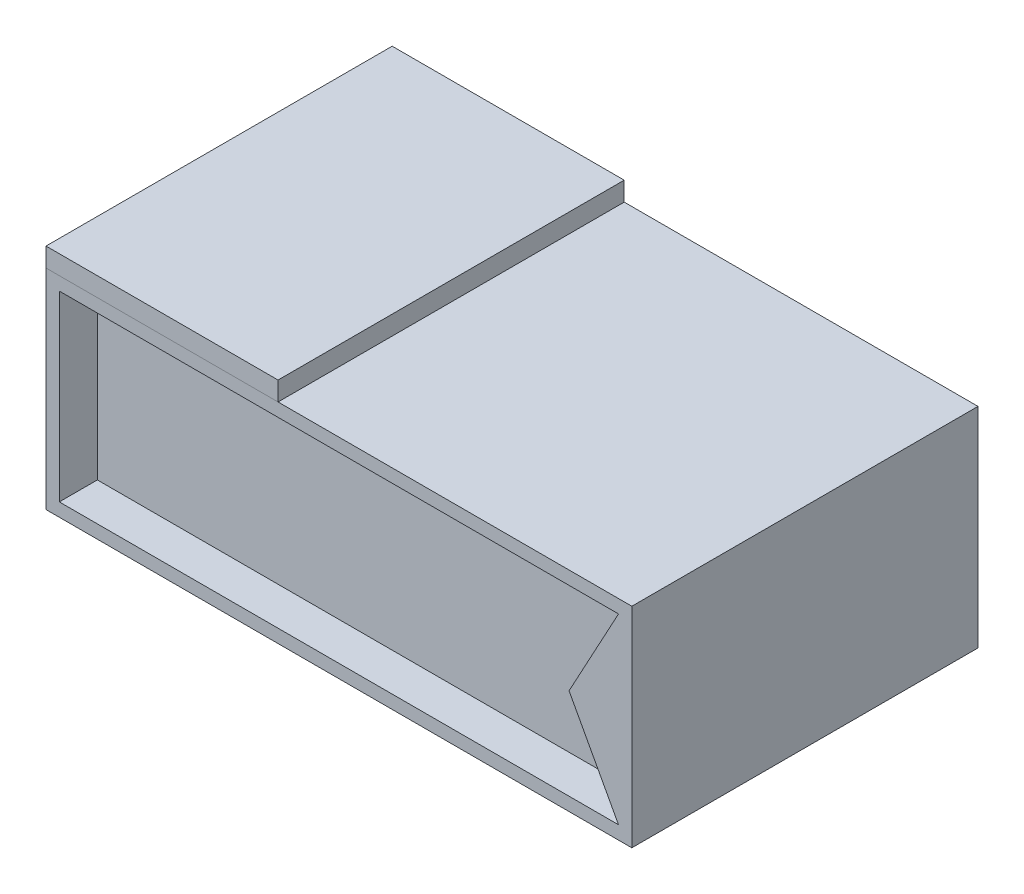
ISO-10303-21;
HEADER;
FILE_DESCRIPTION(('STEP AP214'),'2;1');
FILE_NAME('part.step','',(''),(''),'','','');
FILE_SCHEMA(('AUTOMOTIVE_DESIGN { 1 0 10303 214 1 1 1 1 }'));
ENDSEC;
DATA;
#1=APPLICATION_CONTEXT('core data for automotive mechanical design processes');
#2=APPLICATION_PROTOCOL_DEFINITION('international standard','automotive_design',2000,#1);
#3=PRODUCT_CONTEXT('',#1,'mechanical');
#4=PRODUCT('Part','Part','',(#3));
#5=PRODUCT_RELATED_PRODUCT_CATEGORY('part','',(#4));
#6=PRODUCT_DEFINITION_FORMATION('','',#4);
#7=PRODUCT_DEFINITION_CONTEXT('part definition',#1,'design');
#8=PRODUCT_DEFINITION('design','',#6,#7);
#9=PRODUCT_DEFINITION_SHAPE('','',#8);
#10=(LENGTH_UNIT() NAMED_UNIT(*) SI_UNIT(.MILLI.,.METRE.));
#11=(NAMED_UNIT(*) PLANE_ANGLE_UNIT() SI_UNIT($,.RADIAN.));
#12=(NAMED_UNIT(*) SI_UNIT($,.STERADIAN.) SOLID_ANGLE_UNIT());
#13=UNCERTAINTY_MEASURE_WITH_UNIT(LENGTH_MEASURE(1.E-05),#10,'distance_accuracy_value','');
#14=(GEOMETRIC_REPRESENTATION_CONTEXT(3) GLOBAL_UNCERTAINTY_ASSIGNED_CONTEXT((#13)) GLOBAL_UNIT_ASSIGNED_CONTEXT((#10,
#11,#12)) REPRESENTATION_CONTEXT('',''));
#15=CARTESIAN_POINT('',(0.,0.,0.));
#16=DIRECTION('',(0.,0.,1.));
#17=DIRECTION('',(1.,0.,0.));
#18=AXIS2_PLACEMENT_3D('',#15,#16,#17);
#19=CARTESIAN_POINT('',(-77.,32.5,-45.5));
#20=DIRECTION('',(1.,0.,0.));
#21=DIRECTION('',(0.,0.,-1.));
#22=AXIS2_PLACEMENT_3D('',#19,#20,#21);
#23=PLANE('',#22);
#24=DIRECTION('',(0.,0.,1.));
#25=VECTOR('',#24,1.);
#26=CARTESIAN_POINT('',(-77.,27.5,-45.5));
#27=LINE('',#26,#25);
#28=CARTESIAN_POINT('',(-77.,27.5,-45.5));
#29=VERTEX_POINT('',#28);
#30=CARTESIAN_POINT('',(-77.,27.5,45.5));
#31=VERTEX_POINT('',#30);
#32=EDGE_CURVE('E109',#29,#31,#27,.T.);
#33=ORIENTED_EDGE('',*,*,#32,.T.);
#34=DIRECTION('',(0.,-1.,0.));
#35=VECTOR('',#34,1.);
#36=CARTESIAN_POINT('',(-77.,32.5,45.5));
#37=LINE('',#36,#35);
#38=CARTESIAN_POINT('',(-77.,32.5,45.5));
#39=VERTEX_POINT('',#38);
#40=EDGE_CURVE('E12',#39,#31,#37,.T.);
#41=ORIENTED_EDGE('',*,*,#40,.F.);
#42=DIRECTION('',(0.,0.,1.));
#43=VECTOR('',#42,1.);
#44=CARTESIAN_POINT('',(-77.,32.5,-45.5));
#45=LINE('',#44,#43);
#46=CARTESIAN_POINT('',(-77.,32.5,-45.5));
#47=VERTEX_POINT('',#46);
#48=EDGE_CURVE('E97',#47,#39,#45,.T.);
#49=ORIENTED_EDGE('',*,*,#48,.F.);
#50=DIRECTION('',(0.,-1.,0.));
#51=VECTOR('',#50,1.);
#52=CARTESIAN_POINT('',(-77.,32.5,-45.5));
#53=LINE('',#52,#51);
#54=EDGE_CURVE('E105',#47,#29,#53,.T.);
#55=ORIENTED_EDGE('',*,*,#54,.T.);
#56=EDGE_LOOP('',(#33,#41,#49,#55));
#57=FACE_BOUND('',#56,.T.);
#58=ADVANCED_FACE('F46',(#57),#23,.F.);
#59=CARTESIAN_POINT('',(-77.,32.5,45.5));
#60=DIRECTION('',(0.,0.,-1.));
#61=DIRECTION('',(0.,1.,0.));
#62=AXIS2_PLACEMENT_3D('',#59,#60,#61);
#63=PLANE('',#62);
#64=DIRECTION('',(1.,0.,0.));
#65=VECTOR('',#64,1.);
#66=CARTESIAN_POINT('',(-77.,27.5,45.5));
#67=LINE('',#66,#65);
#68=CARTESIAN_POINT('',(-16.,27.5,45.5));
#69=VERTEX_POINT('',#68);
#70=EDGE_CURVE('E101',#31,#69,#67,.T.);
#71=ORIENTED_EDGE('',*,*,#70,.T.);
#72=DIRECTION('',(0.,-1.,0.));
#73=VECTOR('',#72,1.);
#74=CARTESIAN_POINT('',(-16.,32.5,45.5));
#75=LINE('',#74,#73);
#76=CARTESIAN_POINT('',(-16.,32.5,45.5));
#77=VERTEX_POINT('',#76);
#78=EDGE_CURVE('E54',#77,#69,#75,.T.);
#79=ORIENTED_EDGE('',*,*,#78,.F.);
#80=DIRECTION('',(1.,0.,0.));
#81=VECTOR('',#80,1.);
#82=CARTESIAN_POINT('',(-77.,32.5,45.5));
#83=LINE('',#82,#81);
#84=EDGE_CURVE('E92',#39,#77,#83,.T.);
#85=ORIENTED_EDGE('',*,*,#84,.F.);
#86=ORIENTED_EDGE('',*,*,#40,.T.);
#87=EDGE_LOOP('',(#71,#79,#85,#86));
#88=FACE_BOUND('',#87,.T.);
#89=ADVANCED_FACE('F100',(#88),#63,.F.);
#90=CARTESIAN_POINT('',(-16.,32.5,-45.5));
#91=DIRECTION('',(-1.,0.,0.));
#92=DIRECTION('',(0.,0.,1.));
#93=AXIS2_PLACEMENT_3D('',#90,#91,#92);
#94=PLANE('',#93);
#95=DIRECTION('',(0.,0.,-1.));
#96=VECTOR('',#95,1.);
#97=CARTESIAN_POINT('',(-16.,27.5,-45.5));
#98=LINE('',#97,#96);
#99=CARTESIAN_POINT('',(-16.,27.5,-45.5));
#100=VERTEX_POINT('',#99);
#101=EDGE_CURVE('E79',#69,#100,#98,.T.);
#102=ORIENTED_EDGE('',*,*,#101,.T.);
#103=DIRECTION('',(0.,-1.,0.));
#104=VECTOR('',#103,1.);
#105=CARTESIAN_POINT('',(-16.,32.5,-45.5));
#106=LINE('',#105,#104);
#107=CARTESIAN_POINT('',(-16.,32.5,-45.5));
#108=VERTEX_POINT('',#107);
#109=EDGE_CURVE('E102',#108,#100,#106,.T.);
#110=ORIENTED_EDGE('',*,*,#109,.F.);
#111=DIRECTION('',(0.,0.,-1.));
#112=VECTOR('',#111,1.);
#113=CARTESIAN_POINT('',(-16.,32.5,-45.5));
#114=LINE('',#113,#112);
#115=EDGE_CURVE('E95',#77,#108,#114,.T.);
#116=ORIENTED_EDGE('',*,*,#115,.F.);
#117=ORIENTED_EDGE('',*,*,#78,.T.);
#118=EDGE_LOOP('',(#102,#110,#116,#117));
#119=FACE_BOUND('',#118,.T.);
#120=ADVANCED_FACE('F103',(#119),#94,.F.);
#121=CARTESIAN_POINT('',(-77.,32.5,-45.5));
#122=DIRECTION('',(0.,0.,1.));
#123=DIRECTION('',(0.,-1.,0.));
#124=AXIS2_PLACEMENT_3D('',#121,#122,#123);
#125=PLANE('',#124);
#126=DIRECTION('',(-1.,0.,0.));
#127=VECTOR('',#126,1.);
#128=CARTESIAN_POINT('',(-77.,27.5,-45.5));
#129=LINE('',#128,#127);
#130=EDGE_CURVE('E85',#100,#29,#129,.T.);
#131=ORIENTED_EDGE('',*,*,#130,.T.);
#132=ORIENTED_EDGE('',*,*,#54,.F.);
#133=DIRECTION('',(-1.,0.,0.));
#134=VECTOR('',#133,1.);
#135=CARTESIAN_POINT('',(-77.,32.5,-45.5));
#136=LINE('',#135,#134);
#137=EDGE_CURVE('E62',#108,#47,#136,.T.);
#138=ORIENTED_EDGE('',*,*,#137,.F.);
#139=ORIENTED_EDGE('',*,*,#109,.T.);
#140=EDGE_LOOP('',(#131,#132,#138,#139));
#141=FACE_BOUND('',#140,.T.);
#142=ADVANCED_FACE('F116',(#141),#125,.F.);
#143=CARTESIAN_POINT('',(0.,32.5,0.));
#144=DIRECTION('',(0.,1.,0.));
#145=DIRECTION('',(0.,0.,1.));
#146=AXIS2_PLACEMENT_3D('',#143,#144,#145);
#147=PLANE('',#146);
#148=ORIENTED_EDGE('',*,*,#48,.T.);
#149=ORIENTED_EDGE('',*,*,#84,.T.);
#150=ORIENTED_EDGE('',*,*,#115,.T.);
#151=ORIENTED_EDGE('',*,*,#137,.T.);
#152=EDGE_LOOP('',(#148,#149,#150,#151));
#153=FACE_BOUND('',#152,.T.);
#154=ADVANCED_FACE('F93',(#153),#147,.T.);
#155=CARTESIAN_POINT('',(0.,27.5,0.));
#156=DIRECTION('',(0.,1.,0.));
#157=DIRECTION('',(0.,0.,1.));
#158=AXIS2_PLACEMENT_3D('',#155,#156,#157);
#159=PLANE('',#158);
#160=ORIENTED_EDGE('',*,*,#32,.F.);
#161=ORIENTED_EDGE('',*,*,#130,.F.);
#162=ORIENTED_EDGE('',*,*,#101,.F.);
#163=ORIENTED_EDGE('',*,*,#70,.F.);
#164=EDGE_LOOP('',(#160,#161,#162,#163));
#165=FACE_BOUND('',#164,.T.);
#166=ADVANCED_FACE('F119',(#165),#159,.F.);
#167=CLOSED_SHELL('',(#58,#89,#120,#142,#154,#166));
#168=MANIFOLD_SOLID_BREP('B2',#167);
#169=CARTESIAN_POINT('',(77.,27.5,-45.5));
#170=DIRECTION('',(0.,0.,1.));
#171=DIRECTION('',(1.,0.,0.));
#172=AXIS2_PLACEMENT_3D('',#169,#170,#171);
#173=PLANE('',#172);
#174=DIRECTION('',(0.,1.,0.));
#175=VECTOR('',#174,1.);
#176=CARTESIAN_POINT('',(-77.,27.5,-45.5));
#177=LINE('',#176,#175);
#178=CARTESIAN_POINT('',(-77.,-27.5,-45.5));
#179=VERTEX_POINT('',#178);
#180=CARTESIAN_POINT('',(-77.,27.5,-45.5));
#181=VERTEX_POINT('',#180);
#182=EDGE_CURVE('E370',#179,#181,#177,.T.);
#183=ORIENTED_EDGE('',*,*,#182,.T.);
#184=DIRECTION('',(-1.,0.,0.));
#185=VECTOR('',#184,1.);
#186=CARTESIAN_POINT('',(77.,27.5,-45.5));
#187=LINE('',#186,#185);
#188=CARTESIAN_POINT('',(77.,27.5,-45.5));
#189=VERTEX_POINT('',#188);
#190=EDGE_CURVE('E375',#189,#181,#187,.T.);
#191=ORIENTED_EDGE('',*,*,#190,.F.);
#192=DIRECTION('',(0.,1.,0.));
#193=VECTOR('',#192,1.);
#194=CARTESIAN_POINT('',(77.,27.5,-45.5));
#195=LINE('',#194,#193);
#196=CARTESIAN_POINT('',(77.,-27.5,-45.5));
#197=VERTEX_POINT('',#196);
#198=EDGE_CURVE('E361',#197,#189,#195,.T.);
#199=ORIENTED_EDGE('',*,*,#198,.F.);
#200=DIRECTION('',(-1.,0.,0.));
#201=VECTOR('',#200,1.);
#202=CARTESIAN_POINT('',(77.,-27.5,-45.5));
#203=LINE('',#202,#201);
#204=EDGE_CURVE('E177',#197,#179,#203,.T.);
#205=ORIENTED_EDGE('',*,*,#204,.T.);
#206=EDGE_LOOP('',(#183,#191,#199,#205));
#207=FACE_BOUND('',#206,.T.);
#208=DIRECTION('',(0.,-1.,0.));
#209=VECTOR('',#208,1.);
#210=CARTESIAN_POINT('',(-73.5,24.,-45.5));
#211=LINE('',#210,#209);
#212=CARTESIAN_POINT('',(-73.5,24.,-45.5));
#213=VERTEX_POINT('',#212);
#214=CARTESIAN_POINT('',(-73.5,-24.,-45.5));
#215=VERTEX_POINT('',#214);
#216=EDGE_CURVE('E184',#213,#215,#211,.T.);
#217=ORIENTED_EDGE('',*,*,#216,.T.);
#218=DIRECTION('',(1.,0.,0.));
#219=VECTOR('',#218,1.);
#220=CARTESIAN_POINT('',(-73.5,-24.,-45.5));
#221=LINE('',#220,#219);
#222=CARTESIAN_POINT('',(73.5,-24.,-45.5));
#223=VERTEX_POINT('',#222);
#224=EDGE_CURVE('E291',#215,#223,#221,.T.);
#225=ORIENTED_EDGE('',*,*,#224,.T.);
#226=DIRECTION('',(-0.476283148540752,0.879291966536774,0.));
#227=VECTOR('',#226,1.);
#228=CARTESIAN_POINT('',(73.5,-24.,-45.5));
#229=LINE('',#228,#227);
#230=CARTESIAN_POINT('',(60.5,0.,-45.5));
#231=VERTEX_POINT('',#230);
#232=EDGE_CURVE('E294',#223,#231,#229,.T.);
#233=ORIENTED_EDGE('',*,*,#232,.T.);
#234=DIRECTION('',(0.476283148540752,0.879291966536774,0.));
#235=VECTOR('',#234,1.);
#236=CARTESIAN_POINT('',(60.5,0.,-45.5));
#237=LINE('',#236,#235);
#238=CARTESIAN_POINT('',(73.5,24.,-45.5));
#239=VERTEX_POINT('',#238);
#240=EDGE_CURVE('E304',#231,#239,#237,.T.);
#241=ORIENTED_EDGE('',*,*,#240,.T.);
#242=DIRECTION('',(-1.,0.,0.));
#243=VECTOR('',#242,1.);
#244=CARTESIAN_POINT('',(-73.5,24.,-45.5));
#245=LINE('',#244,#243);
#246=EDGE_CURVE('E302',#239,#213,#245,.T.);
#247=ORIENTED_EDGE('',*,*,#246,.T.);
#248=EDGE_LOOP('',(#217,#225,#233,#241,#247));
#249=FACE_BOUND('',#248,.T.);
#250=ADVANCED_FACE('F169',(#207,#249),#173,.F.);
#251=CARTESIAN_POINT('',(77.,27.5,45.5));
#252=DIRECTION('',(0.,0.,-1.));
#253=DIRECTION('',(-1.,0.,0.));
#254=AXIS2_PLACEMENT_3D('',#251,#252,#253);
#255=PLANE('',#254);
#256=DIRECTION('',(1.,0.,0.));
#257=VECTOR('',#256,1.);
#258=CARTESIAN_POINT('',(-73.5,-24.,45.5));
#259=LINE('',#258,#257);
#260=CARTESIAN_POINT('',(-73.5,-24.,45.5));
#261=VERTEX_POINT('',#260);
#262=CARTESIAN_POINT('',(73.5,-24.,45.5));
#263=VERTEX_POINT('',#262);
#264=EDGE_CURVE('E334',#261,#263,#259,.T.);
#265=ORIENTED_EDGE('',*,*,#264,.F.);
#266=DIRECTION('',(0.,-1.,0.));
#267=VECTOR('',#266,1.);
#268=CARTESIAN_POINT('',(-73.5,24.,45.5));
#269=LINE('',#268,#267);
#270=CARTESIAN_POINT('',(-73.5,24.,45.5));
#271=VERTEX_POINT('',#270);
#272=EDGE_CURVE('E192',#271,#261,#269,.T.);
#273=ORIENTED_EDGE('',*,*,#272,.F.);
#274=DIRECTION('',(-1.,0.,0.));
#275=VECTOR('',#274,1.);
#276=CARTESIAN_POINT('',(-73.5,24.,45.5));
#277=LINE('',#276,#275);
#278=CARTESIAN_POINT('',(73.5,24.,45.5));
#279=VERTEX_POINT('',#278);
#280=EDGE_CURVE('E320',#279,#271,#277,.T.);
#281=ORIENTED_EDGE('',*,*,#280,.F.);
#282=DIRECTION('',(0.476283148540752,0.879291966536774,0.));
#283=VECTOR('',#282,1.);
#284=CARTESIAN_POINT('',(60.5,0.,45.5));
#285=LINE('',#284,#283);
#286=CARTESIAN_POINT('',(60.5,0.,45.5));
#287=VERTEX_POINT('',#286);
#288=EDGE_CURVE('E340',#287,#279,#285,.T.);
#289=ORIENTED_EDGE('',*,*,#288,.F.);
#290=DIRECTION('',(-0.476283148540752,0.879291966536774,0.));
#291=VECTOR('',#290,1.);
#292=CARTESIAN_POINT('',(73.5,-24.,45.5));
#293=LINE('',#292,#291);
#294=EDGE_CURVE('E337',#263,#287,#293,.T.);
#295=ORIENTED_EDGE('',*,*,#294,.F.);
#296=EDGE_LOOP('',(#265,#273,#281,#289,#295));
#297=FACE_BOUND('',#296,.T.);
#298=DIRECTION('',(0.,-1.,0.));
#299=VECTOR('',#298,1.);
#300=CARTESIAN_POINT('',(-77.,27.5,45.5));
#301=LINE('',#300,#299);
#302=CARTESIAN_POINT('',(-77.,27.5,45.5));
#303=VERTEX_POINT('',#302);
#304=CARTESIAN_POINT('',(-77.,-27.5,45.5));
#305=VERTEX_POINT('',#304);
#306=EDGE_CURVE('E347',#303,#305,#301,.T.);
#307=ORIENTED_EDGE('',*,*,#306,.T.);
#308=DIRECTION('',(-1.,0.,0.));
#309=VECTOR('',#308,1.);
#310=CARTESIAN_POINT('',(77.,-27.5,45.5));
#311=LINE('',#310,#309);
#312=CARTESIAN_POINT('',(77.,-27.5,45.5));
#313=VERTEX_POINT('',#312);
#314=EDGE_CURVE('E44',#313,#305,#311,.T.);
#315=ORIENTED_EDGE('',*,*,#314,.F.);
#316=DIRECTION('',(0.,-1.,0.));
#317=VECTOR('',#316,1.);
#318=CARTESIAN_POINT('',(77.,27.5,45.5));
#319=LINE('',#318,#317);
#320=CARTESIAN_POINT('',(77.,27.5,45.5));
#321=VERTEX_POINT('',#320);
#322=EDGE_CURVE('E355',#321,#313,#319,.T.);
#323=ORIENTED_EDGE('',*,*,#322,.F.);
#324=DIRECTION('',(-1.,0.,0.));
#325=VECTOR('',#324,1.);
#326=CARTESIAN_POINT('',(77.,27.5,45.5));
#327=LINE('',#326,#325);
#328=EDGE_CURVE('E365',#321,#303,#327,.T.);
#329=ORIENTED_EDGE('',*,*,#328,.T.);
#330=EDGE_LOOP('',(#307,#315,#323,#329));
#331=FACE_BOUND('',#330,.T.);
#332=ADVANCED_FACE('F171',(#297,#331),#255,.F.);
#333=CARTESIAN_POINT('',(77.,-27.5,45.5));
#334=DIRECTION('',(0.,1.,0.));
#335=DIRECTION('',(0.,0.,1.));
#336=AXIS2_PLACEMENT_3D('',#333,#334,#335);
#337=PLANE('',#336);
#338=DIRECTION('',(0.,0.,-1.));
#339=VECTOR('',#338,1.);
#340=CARTESIAN_POINT('',(-77.,-27.5,45.5));
#341=LINE('',#340,#339);
#342=EDGE_CURVE('E368',#305,#179,#341,.T.);
#343=ORIENTED_EDGE('',*,*,#342,.T.);
#344=ORIENTED_EDGE('',*,*,#204,.F.);
#345=DIRECTION('',(0.,0.,-1.));
#346=VECTOR('',#345,1.);
#347=CARTESIAN_POINT('',(77.,-27.5,45.5));
#348=LINE('',#347,#346);
#349=EDGE_CURVE('E358',#313,#197,#348,.T.);
#350=ORIENTED_EDGE('',*,*,#349,.F.);
#351=ORIENTED_EDGE('',*,*,#314,.T.);
#352=EDGE_LOOP('',(#343,#344,#350,#351));
#353=FACE_BOUND('',#352,.T.);
#354=ADVANCED_FACE('F398',(#353),#337,.F.);
#355=CARTESIAN_POINT('',(77.,27.5,45.5));
#356=DIRECTION('',(0.,-1.,0.));
#357=DIRECTION('',(0.,0.,-1.));
#358=AXIS2_PLACEMENT_3D('',#355,#356,#357);
#359=PLANE('',#358);
#360=DIRECTION('',(0.,0.,1.));
#361=VECTOR('',#360,1.);
#362=CARTESIAN_POINT('',(-77.,27.5,45.5));
#363=LINE('',#362,#361);
#364=EDGE_CURVE('E359',#181,#303,#363,.T.);
#365=ORIENTED_EDGE('',*,*,#364,.T.);
#366=ORIENTED_EDGE('',*,*,#328,.F.);
#367=DIRECTION('',(0.,0.,1.));
#368=VECTOR('',#367,1.);
#369=CARTESIAN_POINT('',(77.,27.5,45.5));
#370=LINE('',#369,#368);
#371=EDGE_CURVE('E363',#189,#321,#370,.T.);
#372=ORIENTED_EDGE('',*,*,#371,.F.);
#373=ORIENTED_EDGE('',*,*,#190,.T.);
#374=EDGE_LOOP('',(#365,#366,#372,#373));
#375=FACE_BOUND('',#374,.T.);
#376=ADVANCED_FACE('F391',(#375),#359,.F.);
#377=CARTESIAN_POINT('',(77.,0.,0.));
#378=DIRECTION('',(1.,0.,0.));
#379=DIRECTION('',(0.,0.,-1.));
#380=AXIS2_PLACEMENT_3D('',#377,#378,#379);
#381=PLANE('',#380);
#382=ORIENTED_EDGE('',*,*,#322,.T.);
#383=ORIENTED_EDGE('',*,*,#349,.T.);
#384=ORIENTED_EDGE('',*,*,#198,.T.);
#385=ORIENTED_EDGE('',*,*,#371,.T.);
#386=EDGE_LOOP('',(#382,#383,#384,#385));
#387=FACE_BOUND('',#386,.T.);
#388=ADVANCED_FACE('F397',(#387),#381,.T.);
#389=CARTESIAN_POINT('',(-77.,0.,0.));
#390=DIRECTION('',(1.,0.,0.));
#391=DIRECTION('',(0.,0.,-1.));
#392=AXIS2_PLACEMENT_3D('',#389,#390,#391);
#393=PLANE('',#392);
#394=ORIENTED_EDGE('',*,*,#306,.F.);
#395=ORIENTED_EDGE('',*,*,#364,.F.);
#396=ORIENTED_EDGE('',*,*,#182,.F.);
#397=ORIENTED_EDGE('',*,*,#342,.F.);
#398=EDGE_LOOP('',(#394,#395,#396,#397));
#399=FACE_BOUND('',#398,.T.);
#400=ADVANCED_FACE('F388',(#399),#393,.F.);
#401=CARTESIAN_POINT('',(-73.5,24.,35.5));
#402=DIRECTION('',(-1.,0.,0.));
#403=DIRECTION('',(0.,0.,1.));
#404=AXIS2_PLACEMENT_3D('',#401,#402,#403);
#405=PLANE('',#404);
#406=ORIENTED_EDGE('',*,*,#272,.T.);
#407=DIRECTION('',(0.,0.,1.));
#408=VECTOR('',#407,1.);
#409=CARTESIAN_POINT('',(-73.5,-24.,35.5));
#410=LINE('',#409,#408);
#411=CARTESIAN_POINT('',(-73.5,-24.,35.5));
#412=VERTEX_POINT('',#411);
#413=EDGE_CURVE('E332',#412,#261,#410,.T.);
#414=ORIENTED_EDGE('',*,*,#413,.F.);
#415=DIRECTION('',(0.,-1.,0.));
#416=VECTOR('',#415,1.);
#417=CARTESIAN_POINT('',(-73.5,24.,35.5));
#418=LINE('',#417,#416);
#419=CARTESIAN_POINT('',(-73.5,24.,35.5));
#420=VERTEX_POINT('',#419);
#421=EDGE_CURVE('E316',#420,#412,#418,.T.);
#422=ORIENTED_EDGE('',*,*,#421,.F.);
#423=DIRECTION('',(0.,0.,1.));
#424=VECTOR('',#423,1.);
#425=CARTESIAN_POINT('',(-73.5,24.,35.5));
#426=LINE('',#425,#424);
#427=EDGE_CURVE('E345',#420,#271,#426,.T.);
#428=ORIENTED_EDGE('',*,*,#427,.T.);
#429=EDGE_LOOP('',(#406,#414,#422,#428));
#430=FACE_BOUND('',#429,.T.);
#431=ADVANCED_FACE('F413',(#430),#405,.F.);
#432=CARTESIAN_POINT('',(-73.5,24.,35.5));
#433=DIRECTION('',(0.,1.,0.));
#434=DIRECTION('',(0.,0.,1.));
#435=AXIS2_PLACEMENT_3D('',#432,#433,#434);
#436=PLANE('',#435);
#437=ORIENTED_EDGE('',*,*,#280,.T.);
#438=ORIENTED_EDGE('',*,*,#427,.F.);
#439=DIRECTION('',(-1.,0.,0.));
#440=VECTOR('',#439,1.);
#441=CARTESIAN_POINT('',(-73.5,24.,35.5));
#442=LINE('',#441,#440);
#443=CARTESIAN_POINT('',(73.5,24.,35.5));
#444=VERTEX_POINT('',#443);
#445=EDGE_CURVE('E329',#444,#420,#442,.T.);
#446=ORIENTED_EDGE('',*,*,#445,.F.);
#447=DIRECTION('',(0.,0.,1.));
#448=VECTOR('',#447,1.);
#449=CARTESIAN_POINT('',(73.5,24.,35.5));
#450=LINE('',#449,#448);
#451=EDGE_CURVE('E348',#444,#279,#450,.T.);
#452=ORIENTED_EDGE('',*,*,#451,.T.);
#453=EDGE_LOOP('',(#437,#438,#446,#452));
#454=FACE_BOUND('',#453,.T.);
#455=ADVANCED_FACE('F418',(#454),#436,.F.);
#456=CARTESIAN_POINT('',(60.5,0.,35.5));
#457=DIRECTION('',(0.879291966536774,-0.476283148540752,0.));
#458=DIRECTION('',(0.476283148540752,0.879291966536774,0.));
#459=AXIS2_PLACEMENT_3D('',#456,#457,#458);
#460=PLANE('',#459);
#461=ORIENTED_EDGE('',*,*,#288,.T.);
#462=ORIENTED_EDGE('',*,*,#451,.F.);
#463=DIRECTION('',(0.476283148540752,0.879291966536774,0.));
#464=VECTOR('',#463,1.);
#465=CARTESIAN_POINT('',(60.5,0.,35.5));
#466=LINE('',#465,#464);
#467=CARTESIAN_POINT('',(60.5,0.,35.5));
#468=VERTEX_POINT('',#467);
#469=EDGE_CURVE('E326',#468,#444,#466,.T.);
#470=ORIENTED_EDGE('',*,*,#469,.F.);
#471=DIRECTION('',(0.,0.,1.));
#472=VECTOR('',#471,1.);
#473=CARTESIAN_POINT('',(60.5,0.,35.5));
#474=LINE('',#473,#472);
#475=EDGE_CURVE('E350',#468,#287,#474,.T.);
#476=ORIENTED_EDGE('',*,*,#475,.T.);
#477=EDGE_LOOP('',(#461,#462,#470,#476));
#478=FACE_BOUND('',#477,.T.);
#479=ADVANCED_FACE('F427',(#478),#460,.F.);
#480=CARTESIAN_POINT('',(73.5,-24.,35.5));
#481=DIRECTION('',(0.879291966536774,0.476283148540752,0.));
#482=DIRECTION('',(-0.476283148540752,0.879291966536774,0.));
#483=AXIS2_PLACEMENT_3D('',#480,#481,#482);
#484=PLANE('',#483);
#485=ORIENTED_EDGE('',*,*,#294,.T.);
#486=ORIENTED_EDGE('',*,*,#475,.F.);
#487=DIRECTION('',(-0.476283148540752,0.879291966536774,0.));
#488=VECTOR('',#487,1.);
#489=CARTESIAN_POINT('',(73.5,-24.,35.5));
#490=LINE('',#489,#488);
#491=CARTESIAN_POINT('',(73.5,-24.,35.5));
#492=VERTEX_POINT('',#491);
#493=EDGE_CURVE('E323',#492,#468,#490,.T.);
#494=ORIENTED_EDGE('',*,*,#493,.F.);
#495=DIRECTION('',(0.,0.,1.));
#496=VECTOR('',#495,1.);
#497=CARTESIAN_POINT('',(73.5,-24.,35.5));
#498=LINE('',#497,#496);
#499=EDGE_CURVE('E352',#492,#263,#498,.T.);
#500=ORIENTED_EDGE('',*,*,#499,.T.);
#501=EDGE_LOOP('',(#485,#486,#494,#500));
#502=FACE_BOUND('',#501,.T.);
#503=ADVANCED_FACE('F423',(#502),#484,.F.);
#504=CARTESIAN_POINT('',(-73.5,-24.,35.5));
#505=DIRECTION('',(0.,-1.,0.));
#506=DIRECTION('',(0.,0.,-1.));
#507=AXIS2_PLACEMENT_3D('',#504,#505,#506);
#508=PLANE('',#507);
#509=ORIENTED_EDGE('',*,*,#264,.T.);
#510=ORIENTED_EDGE('',*,*,#499,.F.);
#511=DIRECTION('',(1.,0.,0.));
#512=VECTOR('',#511,1.);
#513=CARTESIAN_POINT('',(-73.5,-24.,35.5));
#514=LINE('',#513,#512);
#515=EDGE_CURVE('E319',#412,#492,#514,.T.);
#516=ORIENTED_EDGE('',*,*,#515,.F.);
#517=ORIENTED_EDGE('',*,*,#413,.T.);
#518=EDGE_LOOP('',(#509,#510,#516,#517));
#519=FACE_BOUND('',#518,.T.);
#520=ADVANCED_FACE('F419',(#519),#508,.F.);
#521=CARTESIAN_POINT('',(0.,0.,35.5));
#522=DIRECTION('',(0.,0.,1.));
#523=DIRECTION('',(1.,0.,0.));
#524=AXIS2_PLACEMENT_3D('',#521,#522,#523);
#525=PLANE('',#524);
#526=ORIENTED_EDGE('',*,*,#421,.T.);
#527=ORIENTED_EDGE('',*,*,#515,.T.);
#528=ORIENTED_EDGE('',*,*,#493,.T.);
#529=ORIENTED_EDGE('',*,*,#469,.T.);
#530=ORIENTED_EDGE('',*,*,#445,.T.);
#531=EDGE_LOOP('',(#526,#527,#528,#529,#530));
#532=FACE_BOUND('',#531,.T.);
#533=ADVANCED_FACE('F422',(#532),#525,.T.);
#534=CARTESIAN_POINT('',(-73.5,24.,-35.5));
#535=DIRECTION('',(1.,0.,0.));
#536=DIRECTION('',(0.,0.,-1.));
#537=AXIS2_PLACEMENT_3D('',#534,#535,#536);
#538=PLANE('',#537);
#539=ORIENTED_EDGE('',*,*,#216,.F.);
#540=DIRECTION('',(0.,0.,-1.));
#541=VECTOR('',#540,1.);
#542=CARTESIAN_POINT('',(-73.5,24.,-35.5));
#543=LINE('',#542,#541);
#544=CARTESIAN_POINT('',(-73.5,24.,-35.5));
#545=VERTEX_POINT('',#544);
#546=EDGE_CURVE('E275',#545,#213,#543,.T.);
#547=ORIENTED_EDGE('',*,*,#546,.F.);
#548=DIRECTION('',(0.,-1.,0.));
#549=VECTOR('',#548,1.);
#550=CARTESIAN_POINT('',(-73.5,24.,-35.5));
#551=LINE('',#550,#549);
#552=CARTESIAN_POINT('',(-73.5,-24.,-35.5));
#553=VERTEX_POINT('',#552);
#554=EDGE_CURVE('E282',#545,#553,#551,.T.);
#555=ORIENTED_EDGE('',*,*,#554,.T.);
#556=DIRECTION('',(0.,0.,-1.));
#557=VECTOR('',#556,1.);
#558=CARTESIAN_POINT('',(-73.5,-24.,-35.5));
#559=LINE('',#558,#557);
#560=EDGE_CURVE('E309',#553,#215,#559,.T.);
#561=ORIENTED_EDGE('',*,*,#560,.T.);
#562=EDGE_LOOP('',(#539,#547,#555,#561));
#563=FACE_BOUND('',#562,.T.);
#564=ADVANCED_FACE('F285',(#563),#538,.T.);
#565=CARTESIAN_POINT('',(-73.5,-24.,-35.5));
#566=DIRECTION('',(0.,1.,0.));
#567=DIRECTION('',(0.,0.,1.));
#568=AXIS2_PLACEMENT_3D('',#565,#566,#567);
#569=PLANE('',#568);
#570=ORIENTED_EDGE('',*,*,#224,.F.);
#571=ORIENTED_EDGE('',*,*,#560,.F.);
#572=DIRECTION('',(1.,0.,0.));
#573=VECTOR('',#572,1.);
#574=CARTESIAN_POINT('',(-73.5,-24.,-35.5));
#575=LINE('',#574,#573);
#576=CARTESIAN_POINT('',(73.5,-24.,-35.5));
#577=VERTEX_POINT('',#576);
#578=EDGE_CURVE('E287',#553,#577,#575,.T.);
#579=ORIENTED_EDGE('',*,*,#578,.T.);
#580=DIRECTION('',(0.,0.,-1.));
#581=VECTOR('',#580,1.);
#582=CARTESIAN_POINT('',(73.5,-24.,-35.5));
#583=LINE('',#582,#581);
#584=EDGE_CURVE('E311',#577,#223,#583,.T.);
#585=ORIENTED_EDGE('',*,*,#584,.T.);
#586=EDGE_LOOP('',(#570,#571,#579,#585));
#587=FACE_BOUND('',#586,.T.);
#588=ADVANCED_FACE('F440',(#587),#569,.T.);
#589=CARTESIAN_POINT('',(73.5,-24.,-35.5));
#590=DIRECTION('',(-0.879291966536774,-0.476283148540752,0.));
#591=DIRECTION('',(0.476283148540752,-0.879291966536774,0.));
#592=AXIS2_PLACEMENT_3D('',#589,#590,#591);
#593=PLANE('',#592);
#594=ORIENTED_EDGE('',*,*,#232,.F.);
#595=ORIENTED_EDGE('',*,*,#584,.F.);
#596=DIRECTION('',(-0.476283148540752,0.879291966536774,0.));
#597=VECTOR('',#596,1.);
#598=CARTESIAN_POINT('',(73.5,-24.,-35.5));
#599=LINE('',#598,#597);
#600=CARTESIAN_POINT('',(60.5,0.,-35.5));
#601=VERTEX_POINT('',#600);
#602=EDGE_CURVE('E298',#577,#601,#599,.T.);
#603=ORIENTED_EDGE('',*,*,#602,.T.);
#604=DIRECTION('',(0.,0.,-1.));
#605=VECTOR('',#604,1.);
#606=CARTESIAN_POINT('',(60.5,0.,-35.5));
#607=LINE('',#606,#605);
#608=EDGE_CURVE('E313',#601,#231,#607,.T.);
#609=ORIENTED_EDGE('',*,*,#608,.T.);
#610=EDGE_LOOP('',(#594,#595,#603,#609));
#611=FACE_BOUND('',#610,.T.);
#612=ADVANCED_FACE('F446',(#611),#593,.T.);
#613=CARTESIAN_POINT('',(60.5,0.,-35.5));
#614=DIRECTION('',(-0.879291966536774,0.476283148540752,0.));
#615=DIRECTION('',(-0.476283148540752,-0.879291966536774,0.));
#616=AXIS2_PLACEMENT_3D('',#613,#614,#615);
#617=PLANE('',#616);
#618=ORIENTED_EDGE('',*,*,#240,.F.);
#619=ORIENTED_EDGE('',*,*,#608,.F.);
#620=DIRECTION('',(0.476283148540752,0.879291966536774,0.));
#621=VECTOR('',#620,1.);
#622=CARTESIAN_POINT('',(60.5,0.,-35.5));
#623=LINE('',#622,#621);
#624=CARTESIAN_POINT('',(73.5,24.,-35.5));
#625=VERTEX_POINT('',#624);
#626=EDGE_CURVE('E281',#601,#625,#623,.T.);
#627=ORIENTED_EDGE('',*,*,#626,.T.);
#628=DIRECTION('',(0.,0.,-1.));
#629=VECTOR('',#628,1.);
#630=CARTESIAN_POINT('',(73.5,24.,-35.5));
#631=LINE('',#630,#629);
#632=EDGE_CURVE('E277',#625,#239,#631,.T.);
#633=ORIENTED_EDGE('',*,*,#632,.T.);
#634=EDGE_LOOP('',(#618,#619,#627,#633));
#635=FACE_BOUND('',#634,.T.);
#636=ADVANCED_FACE('F443',(#635),#617,.T.);
#637=CARTESIAN_POINT('',(-73.5,24.,-35.5));
#638=DIRECTION('',(0.,-1.,0.));
#639=DIRECTION('',(0.,0.,-1.));
#640=AXIS2_PLACEMENT_3D('',#637,#638,#639);
#641=PLANE('',#640);
#642=ORIENTED_EDGE('',*,*,#246,.F.);
#643=ORIENTED_EDGE('',*,*,#632,.F.);
#644=DIRECTION('',(-1.,0.,0.));
#645=VECTOR('',#644,1.);
#646=CARTESIAN_POINT('',(-73.5,24.,-35.5));
#647=LINE('',#646,#645);
#648=EDGE_CURVE('E272',#625,#545,#647,.T.);
#649=ORIENTED_EDGE('',*,*,#648,.T.);
#650=ORIENTED_EDGE('',*,*,#546,.T.);
#651=EDGE_LOOP('',(#642,#643,#649,#650));
#652=FACE_BOUND('',#651,.T.);
#653=ADVANCED_FACE('F274',(#652),#641,.T.);
#654=CARTESIAN_POINT('',(0.,0.,-35.5));
#655=DIRECTION('',(0.,0.,-1.));
#656=DIRECTION('',(1.,0.,0.));
#657=AXIS2_PLACEMENT_3D('',#654,#655,#656);
#658=PLANE('',#657);
#659=ORIENTED_EDGE('',*,*,#554,.F.);
#660=ORIENTED_EDGE('',*,*,#648,.F.);
#661=ORIENTED_EDGE('',*,*,#626,.F.);
#662=ORIENTED_EDGE('',*,*,#602,.F.);
#663=ORIENTED_EDGE('',*,*,#578,.F.);
#664=EDGE_LOOP('',(#659,#660,#661,#662,#663));
#665=FACE_BOUND('',#664,.T.);
#666=ADVANCED_FACE('F289',(#665),#658,.T.);
#667=CLOSED_SHELL('',(#250,#332,#354,#376,#388,#400,#431,#455,#479,#503,#520,#533,#564,#588,
#612,#636,#653,#666));
#668=MANIFOLD_SOLID_BREP('B6',#667);
#669=ADVANCED_BREP_SHAPE_REPRESENTATION('',(#18,#168,#668),#14);
#670=SHAPE_DEFINITION_REPRESENTATION(#9,#669);
ENDSEC;
END-ISO-10303-21;
